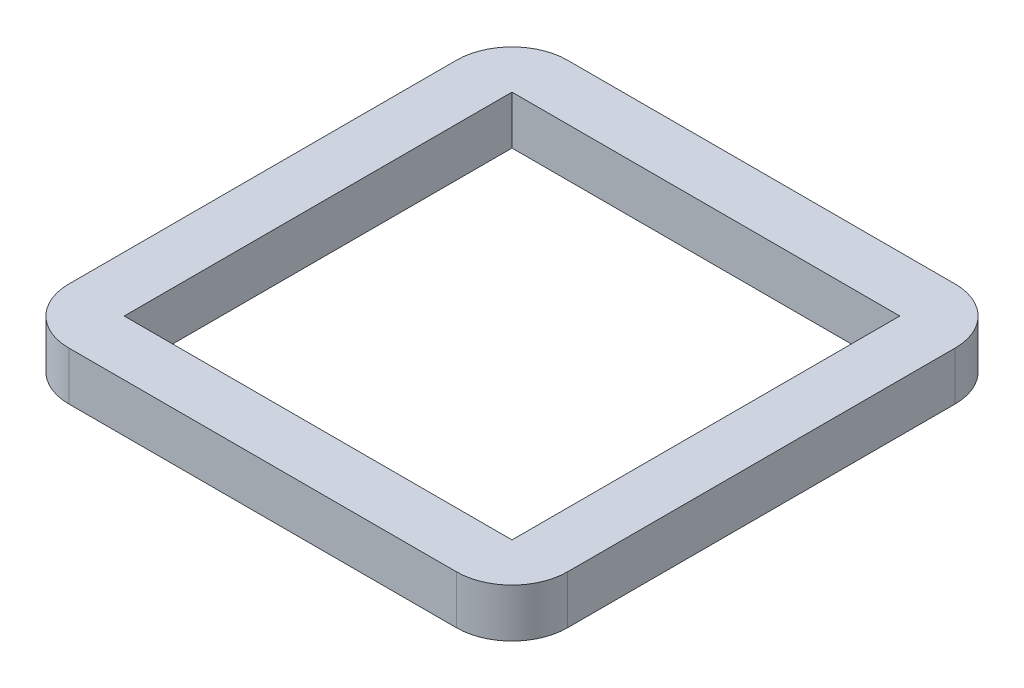
ISO-10303-21;
HEADER;
FILE_DESCRIPTION(('STEP AP214'),'2;1');
FILE_NAME('part.step','',(''),(''),'','','');
FILE_SCHEMA(('AUTOMOTIVE_DESIGN { 1 0 10303 214 1 1 1 1 }'));
ENDSEC;
DATA;
#1=APPLICATION_CONTEXT('core data for automotive mechanical design processes');
#2=APPLICATION_PROTOCOL_DEFINITION('international standard','automotive_design',2000,#1);
#3=PRODUCT_CONTEXT('',#1,'mechanical');
#4=PRODUCT('Part','Part','',(#3));
#5=PRODUCT_RELATED_PRODUCT_CATEGORY('part','',(#4));
#6=PRODUCT_DEFINITION_FORMATION('','',#4);
#7=PRODUCT_DEFINITION_CONTEXT('part definition',#1,'design');
#8=PRODUCT_DEFINITION('design','',#6,#7);
#9=PRODUCT_DEFINITION_SHAPE('','',#8);
#10=(LENGTH_UNIT() NAMED_UNIT(*) SI_UNIT(.MILLI.,.METRE.));
#11=(NAMED_UNIT(*) PLANE_ANGLE_UNIT() SI_UNIT($,.RADIAN.));
#12=(NAMED_UNIT(*) SI_UNIT($,.STERADIAN.) SOLID_ANGLE_UNIT());
#13=UNCERTAINTY_MEASURE_WITH_UNIT(LENGTH_MEASURE(1.E-05),#10,'distance_accuracy_value','');
#14=(GEOMETRIC_REPRESENTATION_CONTEXT(3) GLOBAL_UNCERTAINTY_ASSIGNED_CONTEXT((#13)) GLOBAL_UNIT_ASSIGNED_CONTEXT((#10,
#11,#12)) REPRESENTATION_CONTEXT('',''));
#15=CARTESIAN_POINT('',(0.,0.,0.));
#16=DIRECTION('',(0.,0.,1.));
#17=DIRECTION('',(1.,0.,0.));
#18=AXIS2_PLACEMENT_3D('',#15,#16,#17);
#19=CARTESIAN_POINT('',(-99.4875000000002,-1.75,0.));
#20=DIRECTION('',(1.,0.,0.));
#21=DIRECTION('',(0.,0.,-1.));
#22=AXIS2_PLACEMENT_3D('',#19,#20,#21);
#23=PLANE('',#22);
#24=DIRECTION('',(0.,0.,-1.));
#25=VECTOR('',#24,1.);
#26=CARTESIAN_POINT('',(-99.4875000000002,-1.75,0.));
#27=LINE('',#26,#25);
#28=CARTESIAN_POINT('',(-99.4875000000002,-1.75,-52.5312499999999));
#29=VERTEX_POINT('',#28);
#30=CARTESIAN_POINT('',(-99.4875000000002,-1.75,-66.5312499999999));
#31=VERTEX_POINT('',#30);
#32=EDGE_CURVE('E156',#29,#31,#27,.T.);
#33=ORIENTED_EDGE('',*,*,#32,.F.);
#34=DIRECTION('',(0.,1.,0.));
#35=VECTOR('',#34,1.);
#36=CARTESIAN_POINT('',(-99.4875000000002,0.,-52.5312499999999));
#37=LINE('',#36,#35);
#38=CARTESIAN_POINT('',(-99.4875000000002,0.,-52.5312499999999));
#39=VERTEX_POINT('',#38);
#40=EDGE_CURVE('E191',#29,#39,#37,.T.);
#41=ORIENTED_EDGE('',*,*,#40,.T.);
#42=DIRECTION('',(0.,0.,-1.));
#43=VECTOR('',#42,1.);
#44=CARTESIAN_POINT('',(-99.4875000000002,0.,0.));
#45=LINE('',#44,#43);
#46=CARTESIAN_POINT('',(-99.4875000000002,0.,-66.5312499999999));
#47=VERTEX_POINT('',#46);
#48=EDGE_CURVE('E174',#39,#47,#45,.T.);
#49=ORIENTED_EDGE('',*,*,#48,.T.);
#50=DIRECTION('',(0.,1.,0.));
#51=VECTOR('',#50,1.);
#52=CARTESIAN_POINT('',(-99.4875000000002,-1.75,-66.5312499999999));
#53=LINE('',#52,#51);
#54=EDGE_CURVE('E186',#47,#31,#53,.F.);
#55=ORIENTED_EDGE('',*,*,#54,.T.);
#56=EDGE_LOOP('',(#33,#41,#49,#55));
#57=FACE_BOUND('',#56,.T.);
#58=ADVANCED_FACE('F35',(#57),#23,.F.);
#59=CARTESIAN_POINT('',(0.,-1.75,-68.5312499999999));
#60=DIRECTION('',(0.,0.,1.));
#61=DIRECTION('',(1.,0.,0.));
#62=AXIS2_PLACEMENT_3D('',#59,#60,#61);
#63=PLANE('',#62);
#64=DIRECTION('',(1.,0.,0.));
#65=VECTOR('',#64,1.);
#66=CARTESIAN_POINT('',(0.,0.,-68.5312499999999));
#67=LINE('',#66,#65);
#68=CARTESIAN_POINT('',(-97.4875000000002,0.,-68.5312499999999));
#69=VERTEX_POINT('',#68);
#70=CARTESIAN_POINT('',(-83.4875000000002,0.,-68.5312499999999));
#71=VERTEX_POINT('',#70);
#72=EDGE_CURVE('E145',#69,#71,#67,.T.);
#73=ORIENTED_EDGE('',*,*,#72,.T.);
#74=DIRECTION('',(0.,1.,0.));
#75=VECTOR('',#74,1.);
#76=CARTESIAN_POINT('',(-83.4875000000002,-1.75,-68.5312499999999));
#77=LINE('',#76,#75);
#78=CARTESIAN_POINT('',(-83.4875000000002,-1.75,-68.5312499999999));
#79=VERTEX_POINT('',#78);
#80=EDGE_CURVE('E11',#71,#79,#77,.F.);
#81=ORIENTED_EDGE('',*,*,#80,.T.);
#82=DIRECTION('',(1.,0.,0.));
#83=VECTOR('',#82,1.);
#84=CARTESIAN_POINT('',(0.,-1.75,-68.5312499999999));
#85=LINE('',#84,#83);
#86=CARTESIAN_POINT('',(-97.4875000000002,-1.75,-68.5312499999999));
#87=VERTEX_POINT('',#86);
#88=EDGE_CURVE('E136',#87,#79,#85,.T.);
#89=ORIENTED_EDGE('',*,*,#88,.F.);
#90=DIRECTION('',(0.,1.,0.));
#91=VECTOR('',#90,1.);
#92=CARTESIAN_POINT('',(-97.4875000000002,-1.75,-68.5312499999999));
#93=LINE('',#92,#91);
#94=EDGE_CURVE('E43',#87,#69,#93,.T.);
#95=ORIENTED_EDGE('',*,*,#94,.T.);
#96=EDGE_LOOP('',(#73,#81,#89,#95));
#97=FACE_BOUND('',#96,.T.);
#98=ADVANCED_FACE('F222',(#97),#63,.F.);
#99=CARTESIAN_POINT('',(-81.4875000000002,-1.75,0.));
#100=DIRECTION('',(1.,0.,0.));
#101=DIRECTION('',(0.,0.,-1.));
#102=AXIS2_PLACEMENT_3D('',#99,#100,#101);
#103=PLANE('',#102);
#104=DIRECTION('',(0.,0.,-1.));
#105=VECTOR('',#104,1.);
#106=CARTESIAN_POINT('',(-81.4875000000002,0.,0.));
#107=LINE('',#106,#105);
#108=CARTESIAN_POINT('',(-81.4875000000002,0.,-52.5312499999999));
#109=VERTEX_POINT('',#108);
#110=CARTESIAN_POINT('',(-81.4875000000002,0.,-66.5312499999999));
#111=VERTEX_POINT('',#110);
#112=EDGE_CURVE('E180',#109,#111,#107,.T.);
#113=ORIENTED_EDGE('',*,*,#112,.F.);
#114=DIRECTION('',(0.,1.,0.));
#115=VECTOR('',#114,1.);
#116=CARTESIAN_POINT('',(-81.4875000000002,-1.75,-52.5312499999999));
#117=LINE('',#116,#115);
#118=CARTESIAN_POINT('',(-81.4875000000002,-1.75,-52.5312499999999));
#119=VERTEX_POINT('',#118);
#120=EDGE_CURVE('E57',#109,#119,#117,.F.);
#121=ORIENTED_EDGE('',*,*,#120,.T.);
#122=DIRECTION('',(0.,0.,-1.));
#123=VECTOR('',#122,1.);
#124=CARTESIAN_POINT('',(-81.4875000000002,-1.75,0.));
#125=LINE('',#124,#123);
#126=CARTESIAN_POINT('',(-81.4875000000002,-1.75,-66.5312499999999));
#127=VERTEX_POINT('',#126);
#128=EDGE_CURVE('E162',#119,#127,#125,.T.);
#129=ORIENTED_EDGE('',*,*,#128,.T.);
#130=DIRECTION('',(0.,1.,0.));
#131=VECTOR('',#130,1.);
#132=CARTESIAN_POINT('',(-81.4875000000002,0.,-66.5312499999999));
#133=LINE('',#132,#131);
#134=EDGE_CURVE('E214',#127,#111,#133,.T.);
#135=ORIENTED_EDGE('',*,*,#134,.T.);
#136=EDGE_LOOP('',(#113,#121,#129,#135));
#137=FACE_BOUND('',#136,.T.);
#138=ADVANCED_FACE('F232',(#137),#103,.T.);
#139=CARTESIAN_POINT('',(0.,-1.75,-52.5312499999999));
#140=DIRECTION('',(0.,0.,1.));
#141=DIRECTION('',(1.,0.,0.));
#142=AXIS2_PLACEMENT_3D('',#139,#140,#141);
#143=PLANE('',#142);
#144=DIRECTION('',(1.,0.,0.));
#145=VECTOR('',#144,1.);
#146=CARTESIAN_POINT('',(0.,0.,-52.5312499999999));
#147=LINE('',#146,#145);
#148=CARTESIAN_POINT('',(-97.4875000000002,0.,-52.5312499999999));
#149=VERTEX_POINT('',#148);
#150=CARTESIAN_POINT('',(-83.4875000000002,0.,-52.5312499999999));
#151=VERTEX_POINT('',#150);
#152=EDGE_CURVE('E165',#149,#151,#147,.T.);
#153=ORIENTED_EDGE('',*,*,#152,.T.);
#154=DIRECTION('',(0.,1.,0.));
#155=VECTOR('',#154,1.);
#156=CARTESIAN_POINT('',(-83.4875000000002,-1.75,-52.5312499999999));
#157=LINE('',#156,#155);
#158=CARTESIAN_POINT('',(-83.4875000000002,-1.75,-52.5312499999999));
#159=VERTEX_POINT('',#158);
#160=EDGE_CURVE('E143',#159,#151,#157,.T.);
#161=ORIENTED_EDGE('',*,*,#160,.F.);
#162=DIRECTION('',(1.,0.,0.));
#163=VECTOR('',#162,1.);
#164=CARTESIAN_POINT('',(0.,-1.75,-52.5312499999999));
#165=LINE('',#164,#163);
#166=CARTESIAN_POINT('',(-97.4875000000002,-1.75,-52.5312499999999));
#167=VERTEX_POINT('',#166);
#168=EDGE_CURVE('E140',#167,#159,#165,.T.);
#169=ORIENTED_EDGE('',*,*,#168,.F.);
#170=DIRECTION('',(0.,1.,0.));
#171=VECTOR('',#170,1.);
#172=CARTESIAN_POINT('',(-97.4875000000002,-1.75,-52.5312499999999));
#173=LINE('',#172,#171);
#174=EDGE_CURVE('E125',#167,#149,#173,.T.);
#175=ORIENTED_EDGE('',*,*,#174,.T.);
#176=EDGE_LOOP('',(#153,#161,#169,#175));
#177=FACE_BOUND('',#176,.T.);
#178=ADVANCED_FACE('F141',(#177),#143,.F.);
#179=CARTESIAN_POINT('',(-83.4875000000002,-1.75,0.));
#180=DIRECTION('',(1.,0.,0.));
#181=DIRECTION('',(0.,0.,-1.));
#182=AXIS2_PLACEMENT_3D('',#179,#180,#181);
#183=PLANE('',#182);
#184=DIRECTION('',(0.,0.,-1.));
#185=VECTOR('',#184,1.);
#186=CARTESIAN_POINT('',(-83.4875000000002,0.,0.));
#187=LINE('',#186,#185);
#188=CARTESIAN_POINT('',(-83.4875000000002,0.,-66.5312499999999));
#189=VERTEX_POINT('',#188);
#190=EDGE_CURVE('E171',#151,#189,#187,.T.);
#191=ORIENTED_EDGE('',*,*,#190,.T.);
#192=DIRECTION('',(0.,1.,0.));
#193=VECTOR('',#192,1.);
#194=CARTESIAN_POINT('',(-83.4875000000002,-1.75,-66.5312499999999));
#195=LINE('',#194,#193);
#196=CARTESIAN_POINT('',(-83.4875000000002,-1.75,-66.5312499999999));
#197=VERTEX_POINT('',#196);
#198=EDGE_CURVE('E187',#197,#189,#195,.T.);
#199=ORIENTED_EDGE('',*,*,#198,.F.);
#200=DIRECTION('',(0.,0.,-1.));
#201=VECTOR('',#200,1.);
#202=CARTESIAN_POINT('',(-83.4875000000002,-1.75,0.));
#203=LINE('',#202,#201);
#204=EDGE_CURVE('E152',#159,#197,#203,.T.);
#205=ORIENTED_EDGE('',*,*,#204,.F.);
#206=ORIENTED_EDGE('',*,*,#160,.T.);
#207=EDGE_LOOP('',(#191,#199,#205,#206));
#208=FACE_BOUND('',#207,.T.);
#209=ADVANCED_FACE('F262',(#208),#183,.F.);
#210=CARTESIAN_POINT('',(0.,-1.75,-66.5312499999999));
#211=DIRECTION('',(0.,0.,1.));
#212=DIRECTION('',(1.,0.,0.));
#213=AXIS2_PLACEMENT_3D('',#210,#211,#212);
#214=PLANE('',#213);
#215=DIRECTION('',(1.,0.,0.));
#216=VECTOR('',#215,1.);
#217=CARTESIAN_POINT('',(0.,0.,-66.5312499999999));
#218=LINE('',#217,#216);
#219=CARTESIAN_POINT('',(-97.4875000000002,0.,-66.5312499999999));
#220=VERTEX_POINT('',#219);
#221=EDGE_CURVE('E168',#220,#189,#218,.T.);
#222=ORIENTED_EDGE('',*,*,#221,.F.);
#223=DIRECTION('',(0.,1.,0.));
#224=VECTOR('',#223,1.);
#225=CARTESIAN_POINT('',(-97.4875000000002,-1.75,-66.5312499999999));
#226=LINE('',#225,#224);
#227=CARTESIAN_POINT('',(-97.4875000000002,-1.75,-66.5312499999999));
#228=VERTEX_POINT('',#227);
#229=EDGE_CURVE('E135',#228,#220,#226,.T.);
#230=ORIENTED_EDGE('',*,*,#229,.F.);
#231=DIRECTION('',(1.,0.,0.));
#232=VECTOR('',#231,1.);
#233=CARTESIAN_POINT('',(0.,-1.75,-66.5312499999999));
#234=LINE('',#233,#232);
#235=EDGE_CURVE('E150',#228,#197,#234,.T.);
#236=ORIENTED_EDGE('',*,*,#235,.T.);
#237=ORIENTED_EDGE('',*,*,#198,.T.);
#238=EDGE_LOOP('',(#222,#230,#236,#237));
#239=FACE_BOUND('',#238,.T.);
#240=ADVANCED_FACE('F265',(#239),#214,.T.);
#241=CARTESIAN_POINT('',(-97.4875000000002,-1.75,0.));
#242=DIRECTION('',(1.,0.,0.));
#243=DIRECTION('',(0.,0.,-1.));
#244=AXIS2_PLACEMENT_3D('',#241,#242,#243);
#245=PLANE('',#244);
#246=DIRECTION('',(0.,0.,-1.));
#247=VECTOR('',#246,1.);
#248=CARTESIAN_POINT('',(-97.4875000000002,0.,0.));
#249=LINE('',#248,#247);
#250=EDGE_CURVE('E131',#149,#220,#249,.T.);
#251=ORIENTED_EDGE('',*,*,#250,.F.);
#252=ORIENTED_EDGE('',*,*,#174,.F.);
#253=DIRECTION('',(0.,0.,-1.));
#254=VECTOR('',#253,1.);
#255=CARTESIAN_POINT('',(-97.4875000000002,-1.75,0.));
#256=LINE('',#255,#254);
#257=EDGE_CURVE('E129',#167,#228,#256,.T.);
#258=ORIENTED_EDGE('',*,*,#257,.T.);
#259=ORIENTED_EDGE('',*,*,#229,.T.);
#260=EDGE_LOOP('',(#251,#252,#258,#259));
#261=FACE_BOUND('',#260,.T.);
#262=ADVANCED_FACE('F127',(#261),#245,.T.);
#263=CARTESIAN_POINT('',(0.,-1.75,-50.5312499999999));
#264=DIRECTION('',(0.,0.,1.));
#265=DIRECTION('',(1.,0.,0.));
#266=AXIS2_PLACEMENT_3D('',#263,#264,#265);
#267=PLANE('',#266);
#268=DIRECTION('',(1.,0.,0.));
#269=VECTOR('',#268,1.);
#270=CARTESIAN_POINT('',(0.,0.,-50.5312499999999));
#271=LINE('',#270,#269);
#272=CARTESIAN_POINT('',(-97.4875000000002,0.,-50.5312499999999));
#273=VERTEX_POINT('',#272);
#274=CARTESIAN_POINT('',(-83.4875000000002,0.,-50.5312499999999));
#275=VERTEX_POINT('',#274);
#276=EDGE_CURVE('E177',#273,#275,#271,.T.);
#277=ORIENTED_EDGE('',*,*,#276,.F.);
#278=DIRECTION('',(0.,1.,0.));
#279=VECTOR('',#278,1.);
#280=CARTESIAN_POINT('',(-97.4875000000002,-1.75,-50.5312499999999));
#281=LINE('',#280,#279);
#282=CARTESIAN_POINT('',(-97.4875000000002,-1.75,-50.5312499999999));
#283=VERTEX_POINT('',#282);
#284=EDGE_CURVE('E205',#273,#283,#281,.F.);
#285=ORIENTED_EDGE('',*,*,#284,.T.);
#286=DIRECTION('',(1.,0.,0.));
#287=VECTOR('',#286,1.);
#288=CARTESIAN_POINT('',(0.,-1.75,-50.5312499999999));
#289=LINE('',#288,#287);
#290=CARTESIAN_POINT('',(-83.4875000000002,-1.75,-50.5312499999999));
#291=VERTEX_POINT('',#290);
#292=EDGE_CURVE('E159',#283,#291,#289,.T.);
#293=ORIENTED_EDGE('',*,*,#292,.T.);
#294=DIRECTION('',(0.,1.,0.));
#295=VECTOR('',#294,1.);
#296=CARTESIAN_POINT('',(-83.4875000000002,-1.75,-50.5312499999999));
#297=LINE('',#296,#295);
#298=EDGE_CURVE('E202',#291,#275,#297,.T.);
#299=ORIENTED_EDGE('',*,*,#298,.T.);
#300=EDGE_LOOP('',(#277,#285,#293,#299));
#301=FACE_BOUND('',#300,.T.);
#302=ADVANCED_FACE('F240',(#301),#267,.T.);
#303=CARTESIAN_POINT('',(0.,-1.75,0.));
#304=DIRECTION('',(0.,1.,0.));
#305=DIRECTION('',(0.,0.,1.));
#306=AXIS2_PLACEMENT_3D('',#303,#304,#305);
#307=PLANE('',#306);
#308=ORIENTED_EDGE('',*,*,#168,.T.);
#309=ORIENTED_EDGE('',*,*,#204,.T.);
#310=ORIENTED_EDGE('',*,*,#235,.F.);
#311=ORIENTED_EDGE('',*,*,#257,.F.);
#312=EDGE_LOOP('',(#308,#309,#310,#311));
#313=FACE_BOUND('',#312,.T.);
#314=ORIENTED_EDGE('',*,*,#292,.F.);
#315=CARTESIAN_POINT('',(-97.4875000000002,-1.75,-52.5312499999999));
#316=DIRECTION('',(0.,1.,0.));
#317=DIRECTION('',(0.,0.,1.));
#318=AXIS2_PLACEMENT_3D('',#315,#316,#317);
#319=CIRCLE('',#318,2.);
#320=EDGE_CURVE('E212',#283,#29,#319,.F.);
#321=ORIENTED_EDGE('',*,*,#320,.T.);
#322=ORIENTED_EDGE('',*,*,#32,.T.);
#323=CARTESIAN_POINT('',(-97.4875000000002,-1.75,-66.5312499999999));
#324=DIRECTION('',(0.,1.,0.));
#325=DIRECTION('',(0.,0.,1.));
#326=AXIS2_PLACEMENT_3D('',#323,#324,#325);
#327=CIRCLE('',#326,2.);
#328=EDGE_CURVE('E207',#31,#87,#327,.F.);
#329=ORIENTED_EDGE('',*,*,#328,.T.);
#330=ORIENTED_EDGE('',*,*,#88,.T.);
#331=CARTESIAN_POINT('',(-83.4875000000002,-1.75,-66.5312499999999));
#332=DIRECTION('',(0.,1.,0.));
#333=DIRECTION('',(0.,0.,1.));
#334=AXIS2_PLACEMENT_3D('',#331,#332,#333);
#335=CIRCLE('',#334,2.);
#336=EDGE_CURVE('E50',#79,#127,#335,.F.);
#337=ORIENTED_EDGE('',*,*,#336,.T.);
#338=ORIENTED_EDGE('',*,*,#128,.F.);
#339=CARTESIAN_POINT('',(-83.4875000000002,-1.75,-52.5312499999999));
#340=DIRECTION('',(0.,1.,0.));
#341=DIRECTION('',(0.,0.,1.));
#342=AXIS2_PLACEMENT_3D('',#339,#340,#341);
#343=CIRCLE('',#342,2.);
#344=EDGE_CURVE('E210',#119,#291,#343,.F.);
#345=ORIENTED_EDGE('',*,*,#344,.T.);
#346=EDGE_LOOP('',(#314,#321,#322,#329,#330,#337,#338,#345));
#347=FACE_BOUND('',#346,.T.);
#348=ADVANCED_FACE('F148',(#313,#347),#307,.F.);
#349=CARTESIAN_POINT('',(0.,0.,0.));
#350=DIRECTION('',(0.,1.,0.));
#351=DIRECTION('',(0.,0.,1.));
#352=AXIS2_PLACEMENT_3D('',#349,#350,#351);
#353=PLANE('',#352);
#354=ORIENTED_EDGE('',*,*,#152,.F.);
#355=ORIENTED_EDGE('',*,*,#250,.T.);
#356=ORIENTED_EDGE('',*,*,#221,.T.);
#357=ORIENTED_EDGE('',*,*,#190,.F.);
#358=EDGE_LOOP('',(#354,#355,#356,#357));
#359=FACE_BOUND('',#358,.T.);
#360=ORIENTED_EDGE('',*,*,#48,.F.);
#361=CARTESIAN_POINT('',(-97.4875000000002,0.,-52.5312499999999));
#362=DIRECTION('',(0.,1.,0.));
#363=DIRECTION('',(0.,0.,1.));
#364=AXIS2_PLACEMENT_3D('',#361,#362,#363);
#365=CIRCLE('',#364,2.);
#366=EDGE_CURVE('E200',#39,#273,#365,.T.);
#367=ORIENTED_EDGE('',*,*,#366,.T.);
#368=ORIENTED_EDGE('',*,*,#276,.T.);
#369=CARTESIAN_POINT('',(-83.4875000000002,0.,-52.5312499999999));
#370=DIRECTION('',(0.,1.,0.));
#371=DIRECTION('',(0.,0.,1.));
#372=AXIS2_PLACEMENT_3D('',#369,#370,#371);
#373=CIRCLE('',#372,2.);
#374=EDGE_CURVE('E198',#275,#109,#373,.T.);
#375=ORIENTED_EDGE('',*,*,#374,.T.);
#376=ORIENTED_EDGE('',*,*,#112,.T.);
#377=CARTESIAN_POINT('',(-83.4875000000002,0.,-66.5312499999999));
#378=DIRECTION('',(0.,1.,0.));
#379=DIRECTION('',(0.,0.,1.));
#380=AXIS2_PLACEMENT_3D('',#377,#378,#379);
#381=CIRCLE('',#380,2.);
#382=EDGE_CURVE('E196',#111,#71,#381,.T.);
#383=ORIENTED_EDGE('',*,*,#382,.T.);
#384=ORIENTED_EDGE('',*,*,#72,.F.);
#385=CARTESIAN_POINT('',(-97.4875000000002,0.,-66.5312499999999));
#386=DIRECTION('',(0.,1.,0.));
#387=DIRECTION('',(0.,0.,1.));
#388=AXIS2_PLACEMENT_3D('',#385,#386,#387);
#389=CIRCLE('',#388,2.);
#390=EDGE_CURVE('E194',#69,#47,#389,.T.);
#391=ORIENTED_EDGE('',*,*,#390,.T.);
#392=EDGE_LOOP('',(#360,#367,#368,#375,#376,#383,#384,#391));
#393=FACE_BOUND('',#392,.T.);
#394=ADVANCED_FACE('F228',(#359,#393),#353,.T.);
#395=CARTESIAN_POINT('',(-97.4875000000002,-1.75,-52.5312499999999));
#396=DIRECTION('',(0.,-1.,0.));
#397=DIRECTION('',(0.,0.,-1.));
#398=AXIS2_PLACEMENT_3D('',#395,#396,#397);
#399=CYLINDRICAL_SURFACE('',#398,2.);
#400=ORIENTED_EDGE('',*,*,#320,.F.);
#401=ORIENTED_EDGE('',*,*,#284,.F.);
#402=ORIENTED_EDGE('',*,*,#366,.F.);
#403=ORIENTED_EDGE('',*,*,#40,.F.);
#404=EDGE_LOOP('',(#400,#401,#402,#403));
#405=FACE_BOUND('',#404,.T.);
#406=ADVANCED_FACE('F245',(#405),#399,.T.);
#407=CARTESIAN_POINT('',(-83.4875000000002,-1.75,-52.5312499999999));
#408=DIRECTION('',(0.,1.,0.));
#409=DIRECTION('',(0.,0.,1.));
#410=AXIS2_PLACEMENT_3D('',#407,#408,#409);
#411=CYLINDRICAL_SURFACE('',#410,2.);
#412=ORIENTED_EDGE('',*,*,#344,.F.);
#413=ORIENTED_EDGE('',*,*,#120,.F.);
#414=ORIENTED_EDGE('',*,*,#374,.F.);
#415=ORIENTED_EDGE('',*,*,#298,.F.);
#416=EDGE_LOOP('',(#412,#413,#414,#415));
#417=FACE_BOUND('',#416,.T.);
#418=ADVANCED_FACE('F237',(#417),#411,.T.);
#419=CARTESIAN_POINT('',(-83.4875000000002,-1.75,-66.5312499999999));
#420=DIRECTION('',(0.,-1.,0.));
#421=DIRECTION('',(0.,0.,-1.));
#422=AXIS2_PLACEMENT_3D('',#419,#420,#421);
#423=CYLINDRICAL_SURFACE('',#422,2.);
#424=ORIENTED_EDGE('',*,*,#336,.F.);
#425=ORIENTED_EDGE('',*,*,#80,.F.);
#426=ORIENTED_EDGE('',*,*,#382,.F.);
#427=ORIENTED_EDGE('',*,*,#134,.F.);
#428=EDGE_LOOP('',(#424,#425,#426,#427));
#429=FACE_BOUND('',#428,.T.);
#430=ADVANCED_FACE('F231',(#429),#423,.T.);
#431=CARTESIAN_POINT('',(-97.4875000000002,-1.75,-66.5312499999999));
#432=DIRECTION('',(0.,1.,0.));
#433=DIRECTION('',(0.,0.,1.));
#434=AXIS2_PLACEMENT_3D('',#431,#432,#433);
#435=CYLINDRICAL_SURFACE('',#434,2.);
#436=ORIENTED_EDGE('',*,*,#328,.F.);
#437=ORIENTED_EDGE('',*,*,#54,.F.);
#438=ORIENTED_EDGE('',*,*,#390,.F.);
#439=ORIENTED_EDGE('',*,*,#94,.F.);
#440=EDGE_LOOP('',(#436,#437,#438,#439));
#441=FACE_BOUND('',#440,.T.);
#442=ADVANCED_FACE('F37',(#441),#435,.T.);
#443=CLOSED_SHELL('',(#58,#98,#138,#178,#209,#240,#262,#302,#348,#394,#406,#418,#430,#442));
#444=MANIFOLD_SOLID_BREP('B2',#443);
#445=ADVANCED_BREP_SHAPE_REPRESENTATION('',(#18,#444),#14);
#446=SHAPE_DEFINITION_REPRESENTATION(#9,#445);
ENDSEC;
END-ISO-10303-21;
